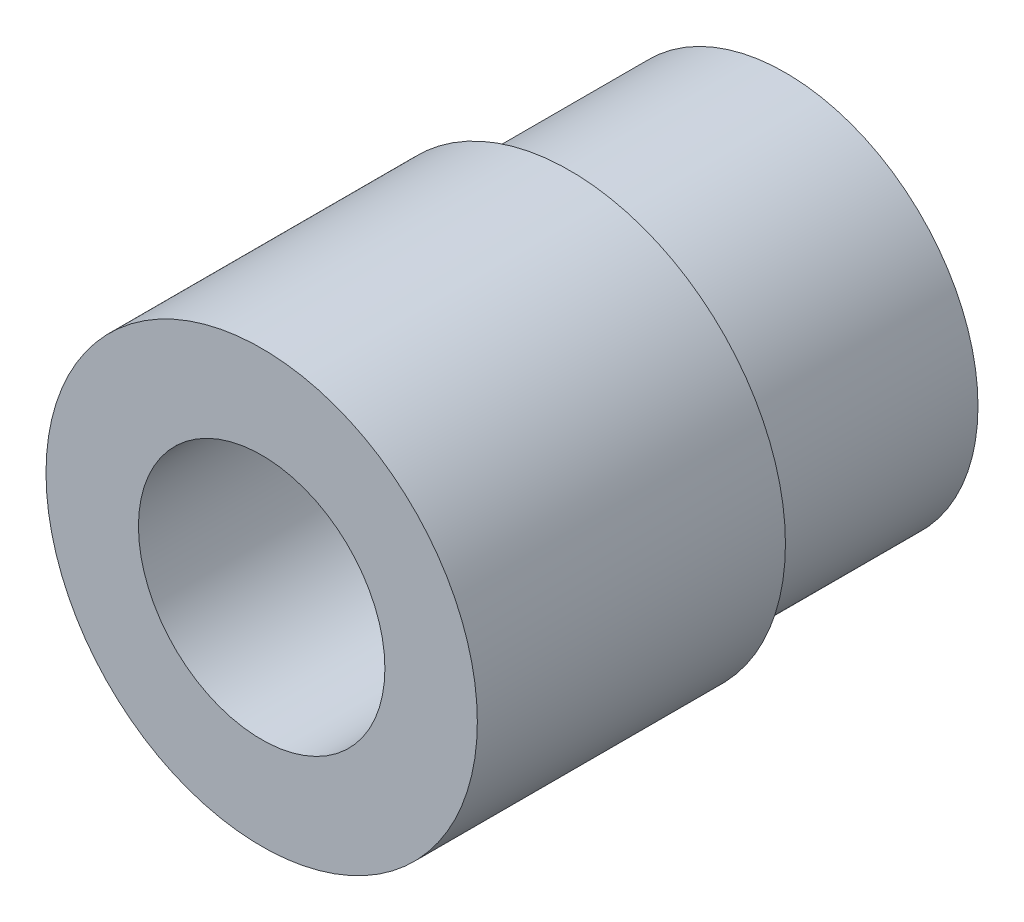
ISO-10303-21;
HEADER;
FILE_DESCRIPTION(('STEP AP214'),'2;1');
FILE_NAME('part.step','',(''),(''),'','','');
FILE_SCHEMA(('AUTOMOTIVE_DESIGN { 1 0 10303 214 1 1 1 1 }'));
ENDSEC;
DATA;
#1=APPLICATION_CONTEXT('core data for automotive mechanical design processes');
#2=APPLICATION_PROTOCOL_DEFINITION('international standard','automotive_design',2000,#1);
#3=PRODUCT_CONTEXT('',#1,'mechanical');
#4=PRODUCT('Part','Part','',(#3));
#5=PRODUCT_RELATED_PRODUCT_CATEGORY('part','',(#4));
#6=PRODUCT_DEFINITION_FORMATION('','',#4);
#7=PRODUCT_DEFINITION_CONTEXT('part definition',#1,'design');
#8=PRODUCT_DEFINITION('design','',#6,#7);
#9=PRODUCT_DEFINITION_SHAPE('','',#8);
#10=(LENGTH_UNIT() NAMED_UNIT(*) SI_UNIT(.MILLI.,.METRE.));
#11=(NAMED_UNIT(*) PLANE_ANGLE_UNIT() SI_UNIT($,.RADIAN.));
#12=(NAMED_UNIT(*) SI_UNIT($,.STERADIAN.) SOLID_ANGLE_UNIT());
#13=UNCERTAINTY_MEASURE_WITH_UNIT(LENGTH_MEASURE(1.E-05),#10,'distance_accuracy_value','');
#14=(GEOMETRIC_REPRESENTATION_CONTEXT(3) GLOBAL_UNCERTAINTY_ASSIGNED_CONTEXT((#13)) GLOBAL_UNIT_ASSIGNED_CONTEXT((#10,
#11,#12)) REPRESENTATION_CONTEXT('',''));
#15=CARTESIAN_POINT('',(0.,0.,0.));
#16=DIRECTION('',(0.,0.,1.));
#17=DIRECTION('',(1.,0.,0.));
#18=AXIS2_PLACEMENT_3D('',#15,#16,#17);
#19=CARTESIAN_POINT('',(0.,0.,14.));
#20=DIRECTION('',(0.,0.,-1.));
#21=DIRECTION('',(-1.,0.,0.));
#22=AXIS2_PLACEMENT_3D('',#19,#20,#21);
#23=CYLINDRICAL_SURFACE('',#22,12.5);
#24=CARTESIAN_POINT('',(0.,0.,14.));
#25=DIRECTION('',(0.,0.,1.));
#26=DIRECTION('',(1.,0.,0.));
#27=AXIS2_PLACEMENT_3D('',#24,#25,#26);
#28=CIRCLE('',#27,12.5);
#29=CARTESIAN_POINT('',(12.5,0.,14.));
#30=VERTEX_POINT('',#29);
#31=EDGE_CURVE('E10',#30,#30,#28,.T.);
#32=ORIENTED_EDGE('',*,*,#31,.F.);
#33=EDGE_LOOP('',(#32));
#34=FACE_BOUND('',#33,.T.);
#35=CARTESIAN_POINT('',(0.,0.,0.));
#36=DIRECTION('',(0.,0.,1.));
#37=DIRECTION('',(1.,0.,0.));
#38=AXIS2_PLACEMENT_3D('',#35,#36,#37);
#39=CIRCLE('',#38,12.5);
#40=CARTESIAN_POINT('',(12.5,0.,0.));
#41=VERTEX_POINT('',#40);
#42=EDGE_CURVE('E36',#41,#41,#39,.T.);
#43=ORIENTED_EDGE('',*,*,#42,.T.);
#44=EDGE_LOOP('',(#43));
#45=FACE_BOUND('',#44,.T.);
#46=ADVANCED_FACE('F30',(#34,#45),#23,.T.);
#47=CARTESIAN_POINT('',(0.,0.,0.));
#48=DIRECTION('',(0.,0.,1.));
#49=DIRECTION('',(1.,0.,0.));
#50=AXIS2_PLACEMENT_3D('',#47,#48,#49);
#51=PLANE('',#50);
#52=CARTESIAN_POINT('',(0.,0.,0.));
#53=DIRECTION('',(0.,0.,1.));
#54=DIRECTION('',(1.,0.,0.));
#55=AXIS2_PLACEMENT_3D('',#52,#53,#54);
#56=CIRCLE('',#55,8.);
#57=CARTESIAN_POINT('',(8.,0.,0.));
#58=VERTEX_POINT('',#57);
#59=EDGE_CURVE('E49',#58,#58,#56,.T.);
#60=ORIENTED_EDGE('',*,*,#59,.T.);
#61=EDGE_LOOP('',(#60));
#62=FACE_BOUND('',#61,.T.);
#63=ORIENTED_EDGE('',*,*,#42,.F.);
#64=EDGE_LOOP('',(#63));
#65=FACE_BOUND('',#64,.T.);
#66=ADVANCED_FACE('F72',(#62,#65),#51,.F.);
#67=CARTESIAN_POINT('',(0.,0.,14.));
#68=DIRECTION('',(0.,0.,1.));
#69=DIRECTION('',(1.,0.,0.));
#70=AXIS2_PLACEMENT_3D('',#67,#68,#69);
#71=PLANE('',#70);
#72=CARTESIAN_POINT('',(0.,0.,14.));
#73=DIRECTION('',(0.,0.,1.));
#74=DIRECTION('',(1.,0.,0.));
#75=AXIS2_PLACEMENT_3D('',#72,#73,#74);
#76=CIRCLE('',#75,14.);
#77=CARTESIAN_POINT('',(14.,0.,14.));
#78=VERTEX_POINT('',#77);
#79=EDGE_CURVE('E44',#78,#78,#76,.T.);
#80=ORIENTED_EDGE('',*,*,#79,.F.);
#81=EDGE_LOOP('',(#80));
#82=FACE_BOUND('',#81,.T.);
#83=ORIENTED_EDGE('',*,*,#31,.T.);
#84=EDGE_LOOP('',(#83));
#85=FACE_BOUND('',#84,.T.);
#86=ADVANCED_FACE('F67',(#82,#85),#71,.F.);
#87=CARTESIAN_POINT('',(0.,0.,34.));
#88=DIRECTION('',(0.,0.,-1.));
#89=DIRECTION('',(-1.,0.,0.));
#90=AXIS2_PLACEMENT_3D('',#87,#88,#89);
#91=CYLINDRICAL_SURFACE('',#90,14.);
#92=CARTESIAN_POINT('',(0.,0.,34.));
#93=DIRECTION('',(0.,0.,1.));
#94=DIRECTION('',(1.,0.,0.));
#95=AXIS2_PLACEMENT_3D('',#92,#93,#94);
#96=CIRCLE('',#95,14.);
#97=CARTESIAN_POINT('',(14.,0.,34.));
#98=VERTEX_POINT('',#97);
#99=EDGE_CURVE('E40',#98,#98,#96,.T.);
#100=ORIENTED_EDGE('',*,*,#99,.F.);
#101=EDGE_LOOP('',(#100));
#102=FACE_BOUND('',#101,.T.);
#103=ORIENTED_EDGE('',*,*,#79,.T.);
#104=EDGE_LOOP('',(#103));
#105=FACE_BOUND('',#104,.T.);
#106=ADVANCED_FACE('F61',(#102,#105),#91,.T.);
#107=CARTESIAN_POINT('',(0.,0.,34.));
#108=DIRECTION('',(0.,0.,1.));
#109=DIRECTION('',(1.,0.,0.));
#110=AXIS2_PLACEMENT_3D('',#107,#108,#109);
#111=PLANE('',#110);
#112=CARTESIAN_POINT('',(0.,0.,34.));
#113=DIRECTION('',(0.,0.,1.));
#114=DIRECTION('',(1.,0.,0.));
#115=AXIS2_PLACEMENT_3D('',#112,#113,#114);
#116=CIRCLE('',#115,8.);
#117=CARTESIAN_POINT('',(8.,0.,34.));
#118=VERTEX_POINT('',#117);
#119=EDGE_CURVE('E52',#118,#118,#116,.T.);
#120=ORIENTED_EDGE('',*,*,#119,.F.);
#121=EDGE_LOOP('',(#120));
#122=FACE_BOUND('',#121,.T.);
#123=ORIENTED_EDGE('',*,*,#99,.T.);
#124=EDGE_LOOP('',(#123));
#125=FACE_BOUND('',#124,.T.);
#126=ADVANCED_FACE('F58',(#122,#125),#111,.T.);
#127=CARTESIAN_POINT('',(0.,0.,0.));
#128=DIRECTION('',(0.,0.,1.));
#129=DIRECTION('',(1.,0.,0.));
#130=AXIS2_PLACEMENT_3D('',#127,#128,#129);
#131=CYLINDRICAL_SURFACE('',#130,8.);
#132=ORIENTED_EDGE('',*,*,#59,.F.);
#133=EDGE_LOOP('',(#132));
#134=FACE_BOUND('',#133,.T.);
#135=ORIENTED_EDGE('',*,*,#119,.T.);
#136=EDGE_LOOP('',(#135));
#137=FACE_BOUND('',#136,.T.);
#138=ADVANCED_FACE('F56',(#134,#137),#131,.F.);
#139=CLOSED_SHELL('',(#46,#66,#86,#106,#126,#138));
#140=MANIFOLD_SOLID_BREP('B2',#139);
#141=ADVANCED_BREP_SHAPE_REPRESENTATION('',(#18,#140),#14);
#142=SHAPE_DEFINITION_REPRESENTATION(#9,#141);
ENDSEC;
END-ISO-10303-21;
